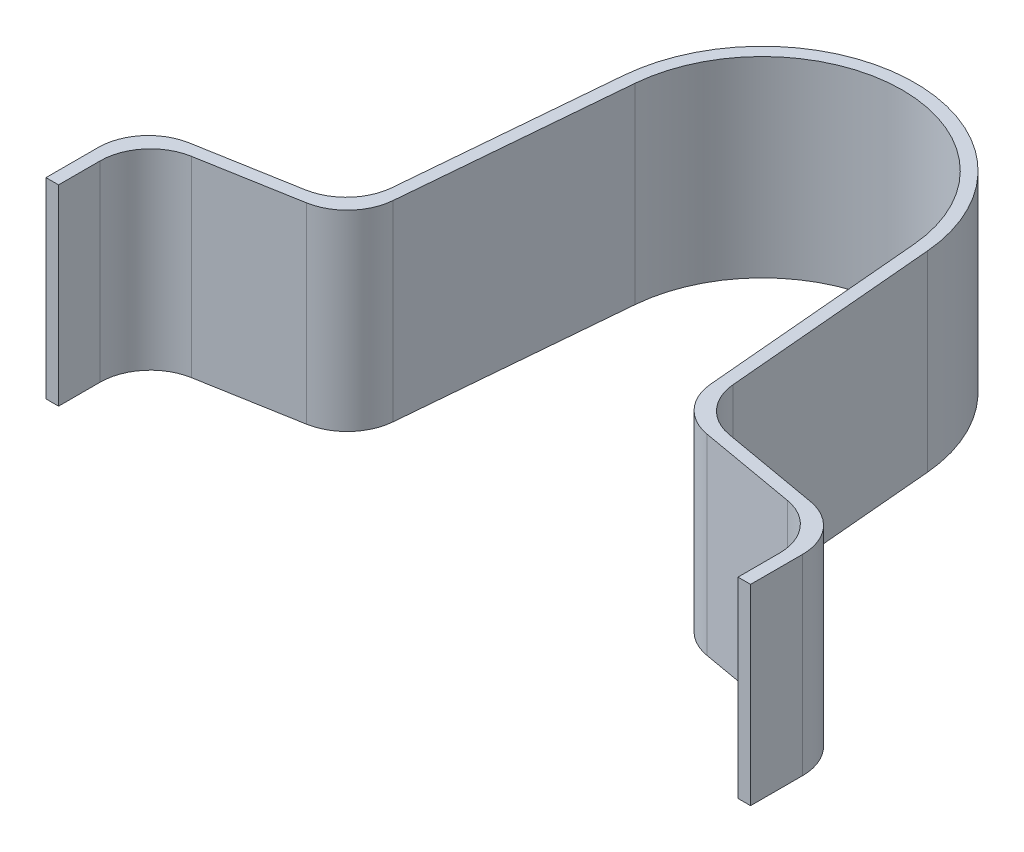
ISO-10303-21;
HEADER;
FILE_DESCRIPTION(('STEP AP214'),'2;1');
FILE_NAME('part.step','',(''),(''),'','','');
FILE_SCHEMA(('AUTOMOTIVE_DESIGN { 1 0 10303 214 1 1 1 1 }'));
ENDSEC;
DATA;
#1=APPLICATION_CONTEXT('core data for automotive mechanical design processes');
#2=APPLICATION_PROTOCOL_DEFINITION('international standard','automotive_design',2000,#1);
#3=PRODUCT_CONTEXT('',#1,'mechanical');
#4=PRODUCT('Part','Part','',(#3));
#5=PRODUCT_RELATED_PRODUCT_CATEGORY('part','',(#4));
#6=PRODUCT_DEFINITION_FORMATION('','',#4);
#7=PRODUCT_DEFINITION_CONTEXT('part definition',#1,'design');
#8=PRODUCT_DEFINITION('design','',#6,#7);
#9=PRODUCT_DEFINITION_SHAPE('','',#8);
#10=(LENGTH_UNIT() NAMED_UNIT(*) SI_UNIT(.MILLI.,.METRE.));
#11=(NAMED_UNIT(*) PLANE_ANGLE_UNIT() SI_UNIT($,.RADIAN.));
#12=(NAMED_UNIT(*) SI_UNIT($,.STERADIAN.) SOLID_ANGLE_UNIT());
#13=UNCERTAINTY_MEASURE_WITH_UNIT(LENGTH_MEASURE(1.E-05),#10,'distance_accuracy_value','');
#14=(GEOMETRIC_REPRESENTATION_CONTEXT(3) GLOBAL_UNCERTAINTY_ASSIGNED_CONTEXT((#13)) GLOBAL_UNIT_ASSIGNED_CONTEXT((#10,
#11,#12)) REPRESENTATION_CONTEXT('',''));
#15=CARTESIAN_POINT('',(0.,0.,0.));
#16=DIRECTION('',(0.,0.,1.));
#17=DIRECTION('',(1.,0.,0.));
#18=AXIS2_PLACEMENT_3D('',#15,#16,#17);
#19=CARTESIAN_POINT('',(0.,0.,0.));
#20=DIRECTION('',(0.,1.,0.));
#21=DIRECTION('',(0.,0.,1.));
#22=AXIS2_PLACEMENT_3D('',#19,#20,#21);
#23=PLANE('',#22);
#24=DIRECTION('',(0.984807753012209,0.,0.173648177666927));
#25=VECTOR('',#24,1.);
#26=CARTESIAN_POINT('',(27.6568491987389,0.,37.8889103884032));
#27=LINE('',#26,#25);
#28=CARTESIAN_POINT('',(33.7029273614535,0.,38.954997095962));
#29=VERTEX_POINT('',#28);
#30=CARTESIAN_POINT('',(49.4024437181634,0.,41.7232454137238));
#31=VERTEX_POINT('',#30);
#32=EDGE_CURVE('E432',#29,#31,#27,.T.);
#33=ORIENTED_EDGE('',*,*,#32,.T.);
#34=CARTESIAN_POINT('',(48.013258296828,0.,49.6017074378215));
#35=DIRECTION('',(0.,1.,0.));
#36=DIRECTION('',(0.,0.,1.));
#37=AXIS2_PLACEMENT_3D('',#34,#35,#36);
#38=CIRCLE('',#37,8.);
#39=CARTESIAN_POINT('',(56.013258296828,0.,49.6017074378215));
#40=VERTEX_POINT('',#39);
#41=EDGE_CURVE('E368',#31,#40,#38,.F.);
#42=ORIENTED_EDGE('',*,*,#41,.T.);
#43=DIRECTION('',(0.,0.,1.));
#44=VECTOR('',#43,1.);
#45=CARTESIAN_POINT('',(56.013258296828,0.,42.8889103884032));
#46=LINE('',#45,#44);
#47=CARTESIAN_POINT('',(56.013258296828,0.,57.8889103884032));
#48=VERTEX_POINT('',#47);
#49=EDGE_CURVE('E264',#40,#48,#46,.T.);
#50=ORIENTED_EDGE('',*,*,#49,.T.);
#51=DIRECTION('',(-1.,0.,0.));
#52=VECTOR('',#51,1.);
#53=CARTESIAN_POINT('',(56.013258296828,0.,57.8889103884032));
#54=LINE('',#53,#52);
#55=CARTESIAN_POINT('',(54.013258296828,0.,57.8889103884032));
#56=VERTEX_POINT('',#55);
#57=EDGE_CURVE('E266',#48,#56,#54,.T.);
#58=ORIENTED_EDGE('',*,*,#57,.T.);
#59=DIRECTION('',(0.,0.,-1.));
#60=VECTOR('',#59,1.);
#61=CARTESIAN_POINT('',(54.013258296828,0.,57.8889103884032));
#62=LINE('',#61,#60);
#63=CARTESIAN_POINT('',(54.013258296828,0.,51.279906700176));
#64=VERTEX_POINT('',#63);
#65=EDGE_CURVE('E246',#56,#64,#62,.T.);
#66=ORIENTED_EDGE('',*,*,#65,.T.);
#67=CARTESIAN_POINT('',(46.013258296828,0.,51.279906700176));
#68=DIRECTION('',(0.,1.,0.));
#69=DIRECTION('',(0.,0.,1.));
#70=AXIS2_PLACEMENT_3D('',#67,#68,#69);
#71=CIRCLE('',#70,8.);
#72=CARTESIAN_POINT('',(47.4024437181634,0.,43.4014446760784));
#73=VERTEX_POINT('',#72);
#74=EDGE_CURVE('E395',#64,#73,#71,.T.);
#75=ORIENTED_EDGE('',*,*,#74,.T.);
#76=DIRECTION('',(-0.984807753012209,0.,-0.173648177666927));
#77=VECTOR('',#76,1.);
#78=CARTESIAN_POINT('',(54.013258296828,0.,44.5671096507578));
#79=LINE('',#78,#77);
#80=CARTESIAN_POINT('',(31.844111465441,0.,40.6580909250968));
#81=VERTEX_POINT('',#80);
#82=EDGE_CURVE('E442',#73,#81,#79,.T.);
#83=ORIENTED_EDGE('',*,*,#82,.T.);
#84=CARTESIAN_POINT('',(33.2332968867764,0.,32.7796289009991));
#85=DIRECTION('',(0.,1.,0.));
#86=DIRECTION('',(0.,0.,1.));
#87=AXIS2_PLACEMENT_3D('',#84,#85,#86);
#88=CIRCLE('',#87,8.);
#89=CARTESIAN_POINT('',(25.2636589650312,0.,33.4759559766474));
#90=VERTEX_POINT('',#89);
#91=EDGE_CURVE('E81',#81,#90,#88,.F.);
#92=ORIENTED_EDGE('',*,*,#91,.T.);
#93=DIRECTION('',(0.0870408844560395,0.,0.996204740218149));
#94=VECTOR('',#93,1.);
#95=CARTESIAN_POINT('',(22.1695402888147,0.,-1.9370078426847));
#96=LINE('',#95,#94);
#97=CARTESIAN_POINT('',(22.1695402888147,0.,-1.93700784268471));
#98=VERTEX_POINT('',#97);
#99=EDGE_CURVE('E324',#98,#90,#96,.T.);
#100=ORIENTED_EDGE('',*,*,#99,.F.);
#101=CARTESIAN_POINT('',(0.,0.,0.));
#102=DIRECTION('',(0.,1.,0.));
#103=DIRECTION('',(0.,0.,1.));
#104=AXIS2_PLACEMENT_3D('',#101,#102,#103);
#105=CIRCLE('',#104,22.254);
#106=CARTESIAN_POINT('',(-22.1695402888147,0.,-1.93700784268471));
#107=VERTEX_POINT('',#106);
#108=EDGE_CURVE('E320',#98,#107,#105,.T.);
#109=ORIENTED_EDGE('',*,*,#108,.T.);
#110=DIRECTION('',(-0.0870408844560395,0.,0.996204740218149));
#111=VECTOR('',#110,1.);
#112=CARTESIAN_POINT('',(-22.1695402888147,0.,-1.9370078426847));
#113=LINE('',#112,#111);
#114=CARTESIAN_POINT('',(-25.2636589650312,0.,33.4759559766474));
#115=VERTEX_POINT('',#114);
#116=EDGE_CURVE('E317',#107,#115,#113,.T.);
#117=ORIENTED_EDGE('',*,*,#116,.T.);
#118=CARTESIAN_POINT('',(-33.2332968867764,0.,32.7796289009991));
#119=DIRECTION('',(0.,1.,0.));
#120=DIRECTION('',(0.,0.,1.));
#121=AXIS2_PLACEMENT_3D('',#118,#119,#120);
#122=CIRCLE('',#121,8.);
#123=CARTESIAN_POINT('',(-31.844111465441,0.,40.6580909250968));
#124=VERTEX_POINT('',#123);
#125=EDGE_CURVE('E363',#115,#124,#122,.F.);
#126=ORIENTED_EDGE('',*,*,#125,.T.);
#127=DIRECTION('',(-0.984807753012209,0.,0.173648177666927));
#128=VECTOR('',#127,1.);
#129=CARTESIAN_POINT('',(-54.0132582968279,0.,44.5671096507578));
#130=LINE('',#129,#128);
#131=CARTESIAN_POINT('',(-47.4024437181634,0.,43.4014446760784));
#132=VERTEX_POINT('',#131);
#133=EDGE_CURVE('E277',#124,#132,#130,.T.);
#134=ORIENTED_EDGE('',*,*,#133,.T.);
#135=CARTESIAN_POINT('',(-46.0132582968279,0.,51.279906700176));
#136=DIRECTION('',(0.,1.,0.));
#137=DIRECTION('',(0.,0.,1.));
#138=AXIS2_PLACEMENT_3D('',#135,#136,#137);
#139=CIRCLE('',#138,8.);
#140=CARTESIAN_POINT('',(-54.0132582968279,0.,51.279906700176));
#141=VERTEX_POINT('',#140);
#142=EDGE_CURVE('E399',#132,#141,#139,.T.);
#143=ORIENTED_EDGE('',*,*,#142,.T.);
#144=DIRECTION('',(0.,0.,1.));
#145=VECTOR('',#144,1.);
#146=CARTESIAN_POINT('',(-54.0132582968279,0.,57.8889103884032));
#147=LINE('',#146,#145);
#148=CARTESIAN_POINT('',(-54.0132582968279,0.,57.8889103884032));
#149=VERTEX_POINT('',#148);
#150=EDGE_CURVE('E275',#141,#149,#147,.T.);
#151=ORIENTED_EDGE('',*,*,#150,.T.);
#152=DIRECTION('',(-1.,0.,0.));
#153=VECTOR('',#152,1.);
#154=CARTESIAN_POINT('',(-56.0132582968279,0.,57.8889103884032));
#155=LINE('',#154,#153);
#156=CARTESIAN_POINT('',(-56.0132582968279,0.,57.8889103884032));
#157=VERTEX_POINT('',#156);
#158=EDGE_CURVE('E272',#149,#157,#155,.T.);
#159=ORIENTED_EDGE('',*,*,#158,.T.);
#160=DIRECTION('',(0.,0.,-1.));
#161=VECTOR('',#160,1.);
#162=CARTESIAN_POINT('',(-56.0132582968279,0.,42.8889103884032));
#163=LINE('',#162,#161);
#164=CARTESIAN_POINT('',(-56.0132582968279,0.,49.6017074378215));
#165=VERTEX_POINT('',#164);
#166=EDGE_CURVE('E269',#157,#165,#163,.T.);
#167=ORIENTED_EDGE('',*,*,#166,.T.);
#168=CARTESIAN_POINT('',(-48.0132582968279,0.,49.6017074378215));
#169=DIRECTION('',(0.,1.,0.));
#170=DIRECTION('',(0.,0.,1.));
#171=AXIS2_PLACEMENT_3D('',#168,#169,#170);
#172=CIRCLE('',#171,8.);
#173=CARTESIAN_POINT('',(-49.4024437181634,0.,41.7232454137238));
#174=VERTEX_POINT('',#173);
#175=EDGE_CURVE('E366',#165,#174,#172,.F.);
#176=ORIENTED_EDGE('',*,*,#175,.T.);
#177=DIRECTION('',(0.984807753012209,0.,-0.173648177666928));
#178=VECTOR('',#177,1.);
#179=CARTESIAN_POINT('',(-27.6568491987389,0.,37.8889103884032));
#180=LINE('',#179,#178);
#181=CARTESIAN_POINT('',(-33.7029273614535,0.,38.954997095962));
#182=VERTEX_POINT('',#181);
#183=EDGE_CURVE('E280',#174,#182,#180,.T.);
#184=ORIENTED_EDGE('',*,*,#183,.T.);
#185=CARTESIAN_POINT('',(-35.0921127827889,0.,31.0765350718644));
#186=DIRECTION('',(0.,1.,0.));
#187=DIRECTION('',(0.,0.,1.));
#188=AXIS2_PLACEMENT_3D('',#185,#186,#187);
#189=CIRCLE('',#188,8.);
#190=CARTESIAN_POINT('',(-27.1224748610437,0.,31.7728621475127));
#191=VERTEX_POINT('',#190);
#192=EDGE_CURVE('E12',#182,#191,#189,.T.);
#193=ORIENTED_EDGE('',*,*,#192,.T.);
#194=DIRECTION('',(-0.0870408844560396,0.,0.996204740218149));
#195=VECTOR('',#194,1.);
#196=CARTESIAN_POINT('',(-24.161949769251,0.,-2.11108961159679));
#197=LINE('',#196,#195);
#198=CARTESIAN_POINT('',(-24.161949769251,0.,-2.11108961159679));
#199=VERTEX_POINT('',#198);
#200=EDGE_CURVE('E305',#199,#191,#197,.T.);
#201=ORIENTED_EDGE('',*,*,#200,.F.);
#202=CARTESIAN_POINT('',(0.,0.,0.));
#203=DIRECTION('',(0.,1.,0.));
#204=DIRECTION('',(0.,0.,1.));
#205=AXIS2_PLACEMENT_3D('',#202,#203,#204);
#206=CIRCLE('',#205,24.254);
#207=CARTESIAN_POINT('',(24.161949769251,0.,-2.11108961159679));
#208=VERTEX_POINT('',#207);
#209=EDGE_CURVE('E326',#208,#199,#206,.T.);
#210=ORIENTED_EDGE('',*,*,#209,.F.);
#211=DIRECTION('',(0.0870408844560396,0.,0.996204740218149));
#212=VECTOR('',#211,1.);
#213=CARTESIAN_POINT('',(24.161949769251,0.,-2.11108961159679));
#214=LINE('',#213,#212);
#215=CARTESIAN_POINT('',(27.1224748610437,0.,31.7728621475127));
#216=VERTEX_POINT('',#215);
#217=EDGE_CURVE('E300',#208,#216,#214,.T.);
#218=ORIENTED_EDGE('',*,*,#217,.T.);
#219=CARTESIAN_POINT('',(35.0921127827889,0.,31.0765350718644));
#220=DIRECTION('',(0.,1.,0.));
#221=DIRECTION('',(0.,0.,1.));
#222=AXIS2_PLACEMENT_3D('',#219,#220,#221);
#223=CIRCLE('',#222,8.);
#224=EDGE_CURVE('E403',#216,#29,#223,.T.);
#225=ORIENTED_EDGE('',*,*,#224,.T.);
#226=EDGE_LOOP('',(#33,#42,#50,#58,#66,#75,#83,#92,#100,#109,#117,#126,#134,#143,#151,#159,#167,
#176,#184,#193,#201,#210,#218,#225));
#227=FACE_BOUND('',#226,.T.);
#228=ADVANCED_FACE('F66',(#227),#23,.F.);
#229=CARTESIAN_POINT('',(0.,30.48,0.));
#230=DIRECTION('',(0.,1.,0.));
#231=DIRECTION('',(0.,0.,1.));
#232=AXIS2_PLACEMENT_3D('',#229,#230,#231);
#233=PLANE('',#232);
#234=DIRECTION('',(0.,0.,-1.));
#235=VECTOR('',#234,1.);
#236=CARTESIAN_POINT('',(56.013258296828,30.48,42.8889103884032));
#237=LINE('',#236,#235);
#238=CARTESIAN_POINT('',(56.013258296828,30.48,57.8889103884032));
#239=VERTEX_POINT('',#238);
#240=CARTESIAN_POINT('',(56.013258296828,30.48,49.6017074378215));
#241=VERTEX_POINT('',#240);
#242=EDGE_CURVE('E255',#239,#241,#237,.T.);
#243=ORIENTED_EDGE('',*,*,#242,.T.);
#244=CARTESIAN_POINT('',(48.013258296828,30.48,49.6017074378215));
#245=DIRECTION('',(0.,1.,0.));
#246=DIRECTION('',(0.,0.,1.));
#247=AXIS2_PLACEMENT_3D('',#244,#245,#246);
#248=CIRCLE('',#247,8.);
#249=CARTESIAN_POINT('',(49.4024437181634,30.48,41.7232454137238));
#250=VERTEX_POINT('',#249);
#251=EDGE_CURVE('E356',#241,#250,#248,.T.);
#252=ORIENTED_EDGE('',*,*,#251,.T.);
#253=DIRECTION('',(-0.984807753012208,0.,-0.173648177666927));
#254=VECTOR('',#253,1.);
#255=CARTESIAN_POINT('',(27.6568491987389,30.48,37.8889103884032));
#256=LINE('',#255,#254);
#257=CARTESIAN_POINT('',(33.7029273614535,30.48,38.954997095962));
#258=VERTEX_POINT('',#257);
#259=EDGE_CURVE('E257',#250,#258,#256,.T.);
#260=ORIENTED_EDGE('',*,*,#259,.T.);
#261=CARTESIAN_POINT('',(35.0921127827889,30.48,31.0765350718644));
#262=DIRECTION('',(0.,1.,0.));
#263=DIRECTION('',(0.,0.,1.));
#264=AXIS2_PLACEMENT_3D('',#261,#262,#263);
#265=CIRCLE('',#264,8.);
#266=CARTESIAN_POINT('',(27.1224748610437,30.48,31.7728621475127));
#267=VERTEX_POINT('',#266);
#268=EDGE_CURVE('E401',#258,#267,#265,.F.);
#269=ORIENTED_EDGE('',*,*,#268,.T.);
#270=DIRECTION('',(0.0870408844560396,0.,0.996204740218149));
#271=VECTOR('',#270,1.);
#272=CARTESIAN_POINT('',(24.161949769251,30.48,-2.11108961159679));
#273=LINE('',#272,#271);
#274=CARTESIAN_POINT('',(24.161949769251,30.48,-2.11108961159679));
#275=VERTEX_POINT('',#274);
#276=EDGE_CURVE('E321',#275,#267,#273,.T.);
#277=ORIENTED_EDGE('',*,*,#276,.F.);
#278=CARTESIAN_POINT('',(0.,30.48,0.));
#279=DIRECTION('',(0.,1.,0.));
#280=DIRECTION('',(0.,0.,1.));
#281=AXIS2_PLACEMENT_3D('',#278,#279,#280);
#282=CIRCLE('',#281,24.254);
#283=CARTESIAN_POINT('',(-24.161949769251,30.48,-2.11108961159679));
#284=VERTEX_POINT('',#283);
#285=EDGE_CURVE('E311',#275,#284,#282,.T.);
#286=ORIENTED_EDGE('',*,*,#285,.T.);
#287=DIRECTION('',(-0.0870408844560396,0.,0.996204740218149));
#288=VECTOR('',#287,1.);
#289=CARTESIAN_POINT('',(-24.161949769251,30.48,-2.11108961159679));
#290=LINE('',#289,#288);
#291=CARTESIAN_POINT('',(-27.1224748610437,30.48,31.7728621475127));
#292=VERTEX_POINT('',#291);
#293=EDGE_CURVE('E313',#284,#292,#290,.T.);
#294=ORIENTED_EDGE('',*,*,#293,.T.);
#295=CARTESIAN_POINT('',(-35.0921127827889,30.48,31.0765350718644));
#296=DIRECTION('',(0.,1.,0.));
#297=DIRECTION('',(0.,0.,1.));
#298=AXIS2_PLACEMENT_3D('',#295,#296,#297);
#299=CIRCLE('',#298,8.);
#300=CARTESIAN_POINT('',(-33.7029273614535,30.48,38.954997095962));
#301=VERTEX_POINT('',#300);
#302=EDGE_CURVE('E74',#292,#301,#299,.F.);
#303=ORIENTED_EDGE('',*,*,#302,.T.);
#304=DIRECTION('',(-0.984807753012209,0.,0.173648177666928));
#305=VECTOR('',#304,1.);
#306=CARTESIAN_POINT('',(-27.6568491987389,30.48,37.8889103884032));
#307=LINE('',#306,#305);
#308=CARTESIAN_POINT('',(-49.4024437181634,30.48,41.7232454137238));
#309=VERTEX_POINT('',#308);
#310=EDGE_CURVE('E268',#301,#309,#307,.T.);
#311=ORIENTED_EDGE('',*,*,#310,.T.);
#312=CARTESIAN_POINT('',(-48.0132582968279,30.48,49.6017074378215));
#313=DIRECTION('',(0.,1.,0.));
#314=DIRECTION('',(0.,0.,1.));
#315=AXIS2_PLACEMENT_3D('',#312,#313,#314);
#316=CIRCLE('',#315,8.);
#317=CARTESIAN_POINT('',(-56.0132582968279,30.48,49.6017074378215));
#318=VERTEX_POINT('',#317);
#319=EDGE_CURVE('E354',#309,#318,#316,.T.);
#320=ORIENTED_EDGE('',*,*,#319,.T.);
#321=DIRECTION('',(0.,0.,1.));
#322=VECTOR('',#321,1.);
#323=CARTESIAN_POINT('',(-56.0132582968279,30.48,42.8889103884032));
#324=LINE('',#323,#322);
#325=CARTESIAN_POINT('',(-56.0132582968279,30.48,57.8889103884032));
#326=VERTEX_POINT('',#325);
#327=EDGE_CURVE('E283',#318,#326,#324,.T.);
#328=ORIENTED_EDGE('',*,*,#327,.T.);
#329=DIRECTION('',(1.,0.,0.));
#330=VECTOR('',#329,1.);
#331=CARTESIAN_POINT('',(-56.0132582968279,30.48,57.8889103884032));
#332=LINE('',#331,#330);
#333=CARTESIAN_POINT('',(-54.0132582968279,30.48,57.8889103884032));
#334=VERTEX_POINT('',#333);
#335=EDGE_CURVE('E285',#326,#334,#332,.T.);
#336=ORIENTED_EDGE('',*,*,#335,.T.);
#337=DIRECTION('',(0.,0.,-1.));
#338=VECTOR('',#337,1.);
#339=CARTESIAN_POINT('',(-54.0132582968279,30.48,57.8889103884032));
#340=LINE('',#339,#338);
#341=CARTESIAN_POINT('',(-54.0132582968279,30.48,51.279906700176));
#342=VERTEX_POINT('',#341);
#343=EDGE_CURVE('E288',#334,#342,#340,.T.);
#344=ORIENTED_EDGE('',*,*,#343,.T.);
#345=CARTESIAN_POINT('',(-46.0132582968279,30.48,51.279906700176));
#346=DIRECTION('',(0.,1.,0.));
#347=DIRECTION('',(0.,0.,1.));
#348=AXIS2_PLACEMENT_3D('',#345,#346,#347);
#349=CIRCLE('',#348,8.);
#350=CARTESIAN_POINT('',(-47.4024437181634,30.48,43.4014446760784));
#351=VERTEX_POINT('',#350);
#352=EDGE_CURVE('E397',#342,#351,#349,.F.);
#353=ORIENTED_EDGE('',*,*,#352,.T.);
#354=DIRECTION('',(0.984807753012209,0.,-0.173648177666927));
#355=VECTOR('',#354,1.);
#356=CARTESIAN_POINT('',(-54.0132582968279,30.48,44.5671096507578));
#357=LINE('',#356,#355);
#358=CARTESIAN_POINT('',(-31.844111465441,30.48,40.6580909250968));
#359=VERTEX_POINT('',#358);
#360=EDGE_CURVE('E291',#351,#359,#357,.T.);
#361=ORIENTED_EDGE('',*,*,#360,.T.);
#362=CARTESIAN_POINT('',(-33.2332968867764,30.48,32.7796289009991));
#363=DIRECTION('',(0.,1.,0.));
#364=DIRECTION('',(0.,0.,1.));
#365=AXIS2_PLACEMENT_3D('',#362,#363,#364);
#366=CIRCLE('',#365,8.);
#367=CARTESIAN_POINT('',(-25.2636589650312,30.48,33.4759559766474));
#368=VERTEX_POINT('',#367);
#369=EDGE_CURVE('E350',#359,#368,#366,.T.);
#370=ORIENTED_EDGE('',*,*,#369,.T.);
#371=DIRECTION('',(-0.0870408844560395,0.,0.996204740218149));
#372=VECTOR('',#371,1.);
#373=CARTESIAN_POINT('',(-22.1695402888147,30.48,-1.9370078426847));
#374=LINE('',#373,#372);
#375=CARTESIAN_POINT('',(-22.1695402888147,30.48,-1.93700784268471));
#376=VERTEX_POINT('',#375);
#377=EDGE_CURVE('E301',#376,#368,#374,.T.);
#378=ORIENTED_EDGE('',*,*,#377,.F.);
#379=CARTESIAN_POINT('',(0.,30.48,0.));
#380=DIRECTION('',(0.,1.,0.));
#381=DIRECTION('',(0.,0.,1.));
#382=AXIS2_PLACEMENT_3D('',#379,#380,#381);
#383=CIRCLE('',#382,22.254);
#384=CARTESIAN_POINT('',(22.1695402888147,30.48,-1.93700784268471));
#385=VERTEX_POINT('',#384);
#386=EDGE_CURVE('E304',#385,#376,#383,.T.);
#387=ORIENTED_EDGE('',*,*,#386,.F.);
#388=DIRECTION('',(0.0870408844560395,0.,0.996204740218149));
#389=VECTOR('',#388,1.);
#390=CARTESIAN_POINT('',(22.1695402888147,30.48,-1.9370078426847));
#391=LINE('',#390,#389);
#392=CARTESIAN_POINT('',(25.2636589650312,30.48,33.4759559766474));
#393=VERTEX_POINT('',#392);
#394=EDGE_CURVE('E308',#385,#393,#391,.T.);
#395=ORIENTED_EDGE('',*,*,#394,.T.);
#396=CARTESIAN_POINT('',(33.2332968867764,30.48,32.7796289009991));
#397=DIRECTION('',(0.,1.,0.));
#398=DIRECTION('',(0.,0.,1.));
#399=AXIS2_PLACEMENT_3D('',#396,#397,#398);
#400=CIRCLE('',#399,8.);
#401=CARTESIAN_POINT('',(31.844111465441,30.48,40.6580909250968));
#402=VERTEX_POINT('',#401);
#403=EDGE_CURVE('E352',#393,#402,#400,.T.);
#404=ORIENTED_EDGE('',*,*,#403,.T.);
#405=DIRECTION('',(0.984807753012209,0.,0.173648177666927));
#406=VECTOR('',#405,1.);
#407=CARTESIAN_POINT('',(54.013258296828,30.48,44.5671096507578));
#408=LINE('',#407,#406);
#409=CARTESIAN_POINT('',(47.4024437181634,30.48,43.4014446760784));
#410=VERTEX_POINT('',#409);
#411=EDGE_CURVE('E250',#402,#410,#408,.T.);
#412=ORIENTED_EDGE('',*,*,#411,.T.);
#413=CARTESIAN_POINT('',(46.013258296828,30.48,51.279906700176));
#414=DIRECTION('',(0.,1.,0.));
#415=DIRECTION('',(0.,0.,1.));
#416=AXIS2_PLACEMENT_3D('',#413,#414,#415);
#417=CIRCLE('',#416,8.);
#418=CARTESIAN_POINT('',(54.013258296828,30.48,51.279906700176));
#419=VERTEX_POINT('',#418);
#420=EDGE_CURVE('E237',#410,#419,#417,.F.);
#421=ORIENTED_EDGE('',*,*,#420,.T.);
#422=DIRECTION('',(0.,0.,1.));
#423=VECTOR('',#422,1.);
#424=CARTESIAN_POINT('',(54.013258296828,30.48,57.8889103884032));
#425=LINE('',#424,#423);
#426=CARTESIAN_POINT('',(54.013258296828,30.48,57.8889103884032));
#427=VERTEX_POINT('',#426);
#428=EDGE_CURVE('E230',#419,#427,#425,.T.);
#429=ORIENTED_EDGE('',*,*,#428,.T.);
#430=DIRECTION('',(1.,0.,0.));
#431=VECTOR('',#430,1.);
#432=CARTESIAN_POINT('',(56.013258296828,30.48,57.8889103884032));
#433=LINE('',#432,#431);
#434=EDGE_CURVE('E235',#427,#239,#433,.T.);
#435=ORIENTED_EDGE('',*,*,#434,.T.);
#436=EDGE_LOOP('',(#243,#252,#260,#269,#277,#286,#294,#303,#311,#320,#328,#336,#344,#353,#361,
#370,#378,#387,#395,#404,#412,#421,#429,#435));
#437=FACE_BOUND('',#436,.T.);
#438=ADVANCED_FACE('F233',(#437),#233,.T.);
#439=CARTESIAN_POINT('',(-22.1695402888147,30.48,-1.9370078426847));
#440=DIRECTION('',(0.996204740218149,0.,0.0870408844560396));
#441=DIRECTION('',(0.0870408844560396,0.,-0.996204740218149));
#442=AXIS2_PLACEMENT_3D('',#439,#440,#441);
#443=PLANE('',#442);
#444=ORIENTED_EDGE('',*,*,#377,.T.);
#445=DIRECTION('',(0.,-1.,0.));
#446=VECTOR('',#445,1.);
#447=CARTESIAN_POINT('',(-25.2636589650312,30.48,33.4759559766474));
#448=LINE('',#447,#446);
#449=EDGE_CURVE('E387',#368,#115,#448,.T.);
#450=ORIENTED_EDGE('',*,*,#449,.T.);
#451=ORIENTED_EDGE('',*,*,#116,.F.);
#452=DIRECTION('',(0.,-1.,0.));
#453=VECTOR('',#452,1.);
#454=CARTESIAN_POINT('',(-22.1695402888147,30.48,-1.93700784268471));
#455=LINE('',#454,#453);
#456=EDGE_CURVE('E334',#376,#107,#455,.T.);
#457=ORIENTED_EDGE('',*,*,#456,.F.);
#458=EDGE_LOOP('',(#444,#450,#451,#457));
#459=FACE_BOUND('',#458,.T.);
#460=ADVANCED_FACE('F467',(#459),#443,.T.);
#461=CARTESIAN_POINT('',(22.1695402888147,30.48,-1.9370078426847));
#462=DIRECTION('',(0.996204740218149,0.,-0.0870408844560396));
#463=DIRECTION('',(-0.0870408844560396,0.,-0.996204740218149));
#464=AXIS2_PLACEMENT_3D('',#461,#462,#463);
#465=PLANE('',#464);
#466=ORIENTED_EDGE('',*,*,#99,.T.);
#467=DIRECTION('',(0.,1.,0.));
#468=VECTOR('',#467,1.);
#469=CARTESIAN_POINT('',(25.2636589650312,30.48,33.4759559766474));
#470=LINE('',#469,#468);
#471=EDGE_CURVE('E384',#90,#393,#470,.T.);
#472=ORIENTED_EDGE('',*,*,#471,.T.);
#473=ORIENTED_EDGE('',*,*,#394,.F.);
#474=DIRECTION('',(0.,-1.,0.));
#475=VECTOR('',#474,1.);
#476=CARTESIAN_POINT('',(22.1695402888147,30.48,-1.93700784268471));
#477=LINE('',#476,#475);
#478=EDGE_CURVE('E332',#385,#98,#477,.T.);
#479=ORIENTED_EDGE('',*,*,#478,.T.);
#480=EDGE_LOOP('',(#466,#472,#473,#479));
#481=FACE_BOUND('',#480,.T.);
#482=ADVANCED_FACE('F460',(#481),#465,.F.);
#483=CARTESIAN_POINT('',(0.,30.48,0.));
#484=DIRECTION('',(0.,-1.,0.));
#485=DIRECTION('',(0.,0.,-1.));
#486=AXIS2_PLACEMENT_3D('',#483,#484,#485);
#487=CYLINDRICAL_SURFACE('',#486,24.254);
#488=ORIENTED_EDGE('',*,*,#285,.F.);
#489=DIRECTION('',(0.,-1.,0.));
#490=VECTOR('',#489,1.);
#491=CARTESIAN_POINT('',(24.161949769251,30.48,-2.11108961159679));
#492=LINE('',#491,#490);
#493=EDGE_CURVE('E336',#275,#208,#492,.T.);
#494=ORIENTED_EDGE('',*,*,#493,.T.);
#495=ORIENTED_EDGE('',*,*,#209,.T.);
#496=DIRECTION('',(0.,-1.,0.));
#497=VECTOR('',#496,1.);
#498=CARTESIAN_POINT('',(-24.161949769251,30.48,-2.11108961159679));
#499=LINE('',#498,#497);
#500=EDGE_CURVE('E316',#284,#199,#499,.T.);
#501=ORIENTED_EDGE('',*,*,#500,.F.);
#502=EDGE_LOOP('',(#488,#494,#495,#501));
#503=FACE_BOUND('',#502,.T.);
#504=ADVANCED_FACE('F422',(#503),#487,.T.);
#505=CARTESIAN_POINT('',(-24.161949769251,30.48,-2.11108961159679));
#506=DIRECTION('',(0.996204740218149,0.,0.0870408844560396));
#507=DIRECTION('',(0.0870408844560396,0.,-0.996204740218149));
#508=AXIS2_PLACEMENT_3D('',#505,#506,#507);
#509=PLANE('',#508);
#510=ORIENTED_EDGE('',*,*,#200,.T.);
#511=DIRECTION('',(0.,1.,0.));
#512=VECTOR('',#511,1.);
#513=CARTESIAN_POINT('',(-27.1224748610437,30.48,31.7728621475127));
#514=LINE('',#513,#512);
#515=EDGE_CURVE('E391',#191,#292,#514,.T.);
#516=ORIENTED_EDGE('',*,*,#515,.T.);
#517=ORIENTED_EDGE('',*,*,#293,.F.);
#518=ORIENTED_EDGE('',*,*,#500,.T.);
#519=EDGE_LOOP('',(#510,#516,#517,#518));
#520=FACE_BOUND('',#519,.T.);
#521=ADVANCED_FACE('F418',(#520),#509,.F.);
#522=CARTESIAN_POINT('',(0.,30.48,0.));
#523=DIRECTION('',(0.,-1.,0.));
#524=DIRECTION('',(0.,0.,-1.));
#525=AXIS2_PLACEMENT_3D('',#522,#523,#524);
#526=CYLINDRICAL_SURFACE('',#525,22.254);
#527=ORIENTED_EDGE('',*,*,#108,.F.);
#528=ORIENTED_EDGE('',*,*,#478,.F.);
#529=ORIENTED_EDGE('',*,*,#386,.T.);
#530=ORIENTED_EDGE('',*,*,#456,.T.);
#531=EDGE_LOOP('',(#527,#528,#529,#530));
#532=FACE_BOUND('',#531,.T.);
#533=ADVANCED_FACE('F463',(#532),#526,.F.);
#534=CARTESIAN_POINT('',(24.161949769251,30.48,-2.11108961159679));
#535=DIRECTION('',(0.996204740218149,0.,-0.0870408844560396));
#536=DIRECTION('',(-0.0870408844560396,0.,-0.996204740218149));
#537=AXIS2_PLACEMENT_3D('',#534,#535,#536);
#538=PLANE('',#537);
#539=ORIENTED_EDGE('',*,*,#276,.T.);
#540=DIRECTION('',(0.,1.,0.));
#541=VECTOR('',#540,1.);
#542=CARTESIAN_POINT('',(27.1224748610437,0.,31.7728621475127));
#543=LINE('',#542,#541);
#544=EDGE_CURVE('E89',#267,#216,#543,.F.);
#545=ORIENTED_EDGE('',*,*,#544,.T.);
#546=ORIENTED_EDGE('',*,*,#217,.F.);
#547=ORIENTED_EDGE('',*,*,#493,.F.);
#548=EDGE_LOOP('',(#539,#545,#546,#547));
#549=FACE_BOUND('',#548,.T.);
#550=ADVANCED_FACE('F524',(#549),#538,.T.);
#551=CARTESIAN_POINT('',(-54.0132582968279,-34.6999414543913,44.5671096507578));
#552=DIRECTION('',(0.173648177666927,0.,0.984807753012208));
#553=DIRECTION('',(0.984807753012209,0.,-0.173648177666927));
#554=AXIS2_PLACEMENT_3D('',#551,#552,#553);
#555=PLANE('',#554);
#556=ORIENTED_EDGE('',*,*,#360,.F.);
#557=DIRECTION('',(0.,1.,0.));
#558=VECTOR('',#557,1.);
#559=CARTESIAN_POINT('',(-47.4024437181634,0.,43.4014446760784));
#560=LINE('',#559,#558);
#561=EDGE_CURVE('E382',#351,#132,#560,.F.);
#562=ORIENTED_EDGE('',*,*,#561,.T.);
#563=ORIENTED_EDGE('',*,*,#133,.F.);
#564=DIRECTION('',(0.,-1.,0.));
#565=VECTOR('',#564,1.);
#566=CARTESIAN_POINT('',(-31.844111465441,-34.6999414543913,40.6580909250968));
#567=LINE('',#566,#565);
#568=EDGE_CURVE('E380',#124,#359,#567,.F.);
#569=ORIENTED_EDGE('',*,*,#568,.T.);
#570=EDGE_LOOP('',(#556,#562,#563,#569));
#571=FACE_BOUND('',#570,.T.);
#572=ADVANCED_FACE('F475',(#571),#555,.T.);
#573=CARTESIAN_POINT('',(-54.0132582968279,-34.6999414543913,57.8889103884032));
#574=DIRECTION('',(1.,0.,0.));
#575=DIRECTION('',(0.,0.,-1.));
#576=AXIS2_PLACEMENT_3D('',#573,#574,#575);
#577=PLANE('',#576);
#578=ORIENTED_EDGE('',*,*,#150,.F.);
#579=DIRECTION('',(0.,1.,0.));
#580=VECTOR('',#579,1.);
#581=CARTESIAN_POINT('',(-54.0132582968279,30.48,51.279906700176));
#582=LINE('',#581,#580);
#583=EDGE_CURVE('E377',#141,#342,#582,.T.);
#584=ORIENTED_EDGE('',*,*,#583,.T.);
#585=ORIENTED_EDGE('',*,*,#343,.F.);
#586=DIRECTION('',(0.,1.,0.));
#587=VECTOR('',#586,1.);
#588=CARTESIAN_POINT('',(-54.0132582968279,-34.6999414543913,57.8889103884032));
#589=LINE('',#588,#587);
#590=EDGE_CURVE('E273',#149,#334,#589,.T.);
#591=ORIENTED_EDGE('',*,*,#590,.F.);
#592=EDGE_LOOP('',(#578,#584,#585,#591));
#593=FACE_BOUND('',#592,.T.);
#594=ADVANCED_FACE('F486',(#593),#577,.T.);
#595=CARTESIAN_POINT('',(-56.0132582968279,-34.6999414543913,57.8889103884032));
#596=DIRECTION('',(0.,0.,1.));
#597=DIRECTION('',(1.,0.,0.));
#598=AXIS2_PLACEMENT_3D('',#595,#596,#597);
#599=PLANE('',#598);
#600=ORIENTED_EDGE('',*,*,#158,.F.);
#601=ORIENTED_EDGE('',*,*,#590,.T.);
#602=ORIENTED_EDGE('',*,*,#335,.F.);
#603=DIRECTION('',(0.,1.,0.));
#604=VECTOR('',#603,1.);
#605=CARTESIAN_POINT('',(-56.0132582968279,-34.6999414543913,57.8889103884032));
#606=LINE('',#605,#604);
#607=EDGE_CURVE('E294',#157,#326,#606,.T.);
#608=ORIENTED_EDGE('',*,*,#607,.F.);
#609=EDGE_LOOP('',(#600,#601,#602,#608));
#610=FACE_BOUND('',#609,.T.);
#611=ADVANCED_FACE('F490',(#610),#599,.T.);
#612=CARTESIAN_POINT('',(-56.0132582968279,-34.6999414543913,42.8889103884032));
#613=DIRECTION('',(-1.,0.,0.));
#614=DIRECTION('',(0.,0.,1.));
#615=AXIS2_PLACEMENT_3D('',#612,#613,#614);
#616=PLANE('',#615);
#617=ORIENTED_EDGE('',*,*,#327,.F.);
#618=DIRECTION('',(0.,1.,0.));
#619=VECTOR('',#618,1.);
#620=CARTESIAN_POINT('',(-56.0132582968279,-34.6999414543913,49.6017074378215));
#621=LINE('',#620,#619);
#622=EDGE_CURVE('E375',#318,#165,#621,.F.);
#623=ORIENTED_EDGE('',*,*,#622,.T.);
#624=ORIENTED_EDGE('',*,*,#166,.F.);
#625=ORIENTED_EDGE('',*,*,#607,.T.);
#626=EDGE_LOOP('',(#617,#623,#624,#625));
#627=FACE_BOUND('',#626,.T.);
#628=ADVANCED_FACE('F496',(#627),#616,.T.);
#629=CARTESIAN_POINT('',(-27.6568491987389,-34.6999414543913,37.8889103884032));
#630=DIRECTION('',(-0.173648177666928,0.,-0.984807753012208));
#631=DIRECTION('',(-0.984807753012209,0.,0.173648177666928));
#632=AXIS2_PLACEMENT_3D('',#629,#630,#631);
#633=PLANE('',#632);
#634=ORIENTED_EDGE('',*,*,#183,.F.);
#635=DIRECTION('',(0.,1.,0.));
#636=VECTOR('',#635,1.);
#637=CARTESIAN_POINT('',(-49.4024437181634,-34.6999414543913,41.7232454137238));
#638=LINE('',#637,#636);
#639=EDGE_CURVE('E372',#174,#309,#638,.T.);
#640=ORIENTED_EDGE('',*,*,#639,.T.);
#641=ORIENTED_EDGE('',*,*,#310,.F.);
#642=DIRECTION('',(0.,1.,0.));
#643=VECTOR('',#642,1.);
#644=CARTESIAN_POINT('',(-33.7029273614535,-34.6999414543913,38.954997095962));
#645=LINE('',#644,#643);
#646=EDGE_CURVE('E370',#301,#182,#645,.F.);
#647=ORIENTED_EDGE('',*,*,#646,.T.);
#648=EDGE_LOOP('',(#634,#640,#641,#647));
#649=FACE_BOUND('',#648,.T.);
#650=ADVANCED_FACE('F411',(#649),#633,.T.);
#651=CARTESIAN_POINT('',(54.013258296828,-34.6999414543913,57.8889103884032));
#652=DIRECTION('',(-1.,0.,0.));
#653=DIRECTION('',(0.,0.,1.));
#654=AXIS2_PLACEMENT_3D('',#651,#652,#653);
#655=PLANE('',#654);
#656=ORIENTED_EDGE('',*,*,#428,.F.);
#657=DIRECTION('',(0.,1.,0.));
#658=VECTOR('',#657,1.);
#659=CARTESIAN_POINT('',(54.013258296828,0.,51.279906700176));
#660=LINE('',#659,#658);
#661=EDGE_CURVE('E345',#419,#64,#660,.F.);
#662=ORIENTED_EDGE('',*,*,#661,.T.);
#663=ORIENTED_EDGE('',*,*,#65,.F.);
#664=DIRECTION('',(0.,1.,0.));
#665=VECTOR('',#664,1.);
#666=CARTESIAN_POINT('',(54.013258296828,-34.6999414543913,57.8889103884032));
#667=LINE('',#666,#665);
#668=EDGE_CURVE('E243',#56,#427,#667,.T.);
#669=ORIENTED_EDGE('',*,*,#668,.T.);
#670=EDGE_LOOP('',(#656,#662,#663,#669));
#671=FACE_BOUND('',#670,.T.);
#672=ADVANCED_FACE('F244',(#671),#655,.T.);
#673=CARTESIAN_POINT('',(54.013258296828,-34.6999414543913,44.5671096507578));
#674=DIRECTION('',(-0.173648177666927,0.,0.984807753012209));
#675=DIRECTION('',(0.984807753012209,0.,0.173648177666927));
#676=AXIS2_PLACEMENT_3D('',#673,#674,#675);
#677=PLANE('',#676);
#678=ORIENTED_EDGE('',*,*,#82,.F.);
#679=DIRECTION('',(0.,1.,0.));
#680=VECTOR('',#679,1.);
#681=CARTESIAN_POINT('',(47.4024437181634,30.48,43.4014446760784));
#682=LINE('',#681,#680);
#683=EDGE_CURVE('E342',#73,#410,#682,.T.);
#684=ORIENTED_EDGE('',*,*,#683,.T.);
#685=ORIENTED_EDGE('',*,*,#411,.F.);
#686=DIRECTION('',(0.,1.,0.));
#687=VECTOR('',#686,1.);
#688=CARTESIAN_POINT('',(31.844111465441,0.,40.6580909250967));
#689=LINE('',#688,#687);
#690=EDGE_CURVE('E338',#402,#81,#689,.F.);
#691=ORIENTED_EDGE('',*,*,#690,.T.);
#692=EDGE_LOOP('',(#678,#684,#685,#691));
#693=FACE_BOUND('',#692,.T.);
#694=ADVANCED_FACE('F452',(#693),#677,.T.);
#695=CARTESIAN_POINT('',(27.6568491987389,-34.6999414543913,37.8889103884032));
#696=DIRECTION('',(0.173648177666927,0.,-0.984807753012208));
#697=DIRECTION('',(-0.984807753012209,0.,-0.173648177666927));
#698=AXIS2_PLACEMENT_3D('',#695,#696,#697);
#699=PLANE('',#698);
#700=ORIENTED_EDGE('',*,*,#259,.F.);
#701=DIRECTION('',(0.,1.,0.));
#702=VECTOR('',#701,1.);
#703=CARTESIAN_POINT('',(49.4024437181634,-34.6999414543913,41.7232454137238));
#704=LINE('',#703,#702);
#705=EDGE_CURVE('E361',#250,#31,#704,.F.);
#706=ORIENTED_EDGE('',*,*,#705,.T.);
#707=ORIENTED_EDGE('',*,*,#32,.F.);
#708=DIRECTION('',(0.,1.,0.));
#709=VECTOR('',#708,1.);
#710=CARTESIAN_POINT('',(33.7029273614535,30.48,38.954997095962));
#711=LINE('',#710,#709);
#712=EDGE_CURVE('E358',#29,#258,#711,.T.);
#713=ORIENTED_EDGE('',*,*,#712,.T.);
#714=EDGE_LOOP('',(#700,#706,#707,#713));
#715=FACE_BOUND('',#714,.T.);
#716=ADVANCED_FACE('F430',(#715),#699,.T.);
#717=CARTESIAN_POINT('',(56.013258296828,-34.6999414543913,42.8889103884032));
#718=DIRECTION('',(1.,0.,0.));
#719=DIRECTION('',(0.,0.,-1.));
#720=AXIS2_PLACEMENT_3D('',#717,#718,#719);
#721=PLANE('',#720);
#722=ORIENTED_EDGE('',*,*,#49,.F.);
#723=DIRECTION('',(0.,1.,0.));
#724=VECTOR('',#723,1.);
#725=CARTESIAN_POINT('',(56.013258296828,-34.6999414543913,49.6017074378215));
#726=LINE('',#725,#724);
#727=EDGE_CURVE('E347',#40,#241,#726,.T.);
#728=ORIENTED_EDGE('',*,*,#727,.T.);
#729=ORIENTED_EDGE('',*,*,#242,.F.);
#730=DIRECTION('',(0.,1.,0.));
#731=VECTOR('',#730,1.);
#732=CARTESIAN_POINT('',(56.013258296828,-34.6999414543913,57.8889103884032));
#733=LINE('',#732,#731);
#734=EDGE_CURVE('E249',#48,#239,#733,.T.);
#735=ORIENTED_EDGE('',*,*,#734,.F.);
#736=EDGE_LOOP('',(#722,#728,#729,#735));
#737=FACE_BOUND('',#736,.T.);
#738=ADVANCED_FACE('F440',(#737),#721,.T.);
#739=CARTESIAN_POINT('',(56.013258296828,-34.6999414543913,57.8889103884032));
#740=DIRECTION('',(0.,0.,1.));
#741=DIRECTION('',(1.,0.,0.));
#742=AXIS2_PLACEMENT_3D('',#739,#740,#741);
#743=PLANE('',#742);
#744=ORIENTED_EDGE('',*,*,#57,.F.);
#745=ORIENTED_EDGE('',*,*,#734,.T.);
#746=ORIENTED_EDGE('',*,*,#434,.F.);
#747=ORIENTED_EDGE('',*,*,#668,.F.);
#748=EDGE_LOOP('',(#744,#745,#746,#747));
#749=FACE_BOUND('',#748,.T.);
#750=ADVANCED_FACE('F252',(#749),#743,.T.);
#751=CARTESIAN_POINT('',(46.013258296828,-34.6999414543913,51.279906700176));
#752=DIRECTION('',(0.,-1.,0.));
#753=DIRECTION('',(0.,0.,-1.));
#754=AXIS2_PLACEMENT_3D('',#751,#752,#753);
#755=CYLINDRICAL_SURFACE('',#754,8.);
#756=ORIENTED_EDGE('',*,*,#74,.F.);
#757=ORIENTED_EDGE('',*,*,#661,.F.);
#758=ORIENTED_EDGE('',*,*,#420,.F.);
#759=ORIENTED_EDGE('',*,*,#683,.F.);
#760=EDGE_LOOP('',(#756,#757,#758,#759));
#761=FACE_BOUND('',#760,.T.);
#762=ADVANCED_FACE('F449',(#761),#755,.F.);
#763=CARTESIAN_POINT('',(48.013258296828,-34.6999414543913,49.6017074378215));
#764=DIRECTION('',(0.,1.,0.));
#765=DIRECTION('',(0.,0.,1.));
#766=AXIS2_PLACEMENT_3D('',#763,#764,#765);
#767=CYLINDRICAL_SURFACE('',#766,8.);
#768=ORIENTED_EDGE('',*,*,#41,.F.);
#769=ORIENTED_EDGE('',*,*,#705,.F.);
#770=ORIENTED_EDGE('',*,*,#251,.F.);
#771=ORIENTED_EDGE('',*,*,#727,.F.);
#772=EDGE_LOOP('',(#768,#769,#770,#771));
#773=FACE_BOUND('',#772,.T.);
#774=ADVANCED_FACE('F437',(#773),#767,.T.);
#775=CARTESIAN_POINT('',(-48.0132582968279,-34.6999414543913,49.6017074378215));
#776=DIRECTION('',(0.,1.,0.));
#777=DIRECTION('',(0.,0.,1.));
#778=AXIS2_PLACEMENT_3D('',#775,#776,#777);
#779=CYLINDRICAL_SURFACE('',#778,8.);
#780=ORIENTED_EDGE('',*,*,#175,.F.);
#781=ORIENTED_EDGE('',*,*,#622,.F.);
#782=ORIENTED_EDGE('',*,*,#319,.F.);
#783=ORIENTED_EDGE('',*,*,#639,.F.);
#784=EDGE_LOOP('',(#780,#781,#782,#783));
#785=FACE_BOUND('',#784,.T.);
#786=ADVANCED_FACE('F499',(#785),#779,.T.);
#787=CARTESIAN_POINT('',(-46.0132582968279,-34.6999414543913,51.279906700176));
#788=DIRECTION('',(0.,-1.,0.));
#789=DIRECTION('',(0.,0.,-1.));
#790=AXIS2_PLACEMENT_3D('',#787,#788,#789);
#791=CYLINDRICAL_SURFACE('',#790,8.);
#792=ORIENTED_EDGE('',*,*,#142,.F.);
#793=ORIENTED_EDGE('',*,*,#561,.F.);
#794=ORIENTED_EDGE('',*,*,#352,.F.);
#795=ORIENTED_EDGE('',*,*,#583,.F.);
#796=EDGE_LOOP('',(#792,#793,#794,#795));
#797=FACE_BOUND('',#796,.T.);
#798=ADVANCED_FACE('F480',(#797),#791,.F.);
#799=CARTESIAN_POINT('',(33.2332968867764,30.48,32.7796289009991));
#800=DIRECTION('',(0.,-1.,0.));
#801=DIRECTION('',(0.,0.,-1.));
#802=AXIS2_PLACEMENT_3D('',#799,#800,#801);
#803=CYLINDRICAL_SURFACE('',#802,8.);
#804=ORIENTED_EDGE('',*,*,#91,.F.);
#805=ORIENTED_EDGE('',*,*,#690,.F.);
#806=ORIENTED_EDGE('',*,*,#403,.F.);
#807=ORIENTED_EDGE('',*,*,#471,.F.);
#808=EDGE_LOOP('',(#804,#805,#806,#807));
#809=FACE_BOUND('',#808,.T.);
#810=ADVANCED_FACE('F458',(#809),#803,.T.);
#811=CARTESIAN_POINT('',(-33.2332968867764,30.48,32.7796289009991));
#812=DIRECTION('',(0.,-1.,0.));
#813=DIRECTION('',(0.,0.,-1.));
#814=AXIS2_PLACEMENT_3D('',#811,#812,#813);
#815=CYLINDRICAL_SURFACE('',#814,8.);
#816=ORIENTED_EDGE('',*,*,#369,.F.);
#817=ORIENTED_EDGE('',*,*,#568,.F.);
#818=ORIENTED_EDGE('',*,*,#125,.F.);
#819=ORIENTED_EDGE('',*,*,#449,.F.);
#820=EDGE_LOOP('',(#816,#817,#818,#819));
#821=FACE_BOUND('',#820,.T.);
#822=ADVANCED_FACE('F478',(#821),#815,.T.);
#823=CARTESIAN_POINT('',(35.0921127827889,-34.6999414543913,31.0765350718644));
#824=DIRECTION('',(0.,-1.,0.));
#825=DIRECTION('',(0.,0.,-1.));
#826=AXIS2_PLACEMENT_3D('',#823,#824,#825);
#827=CYLINDRICAL_SURFACE('',#826,8.);
#828=ORIENTED_EDGE('',*,*,#224,.F.);
#829=ORIENTED_EDGE('',*,*,#544,.F.);
#830=ORIENTED_EDGE('',*,*,#268,.F.);
#831=ORIENTED_EDGE('',*,*,#712,.F.);
#832=EDGE_LOOP('',(#828,#829,#830,#831));
#833=FACE_BOUND('',#832,.T.);
#834=ADVANCED_FACE('F427',(#833),#827,.F.);
#835=CARTESIAN_POINT('',(-35.0921127827889,30.48,31.0765350718644));
#836=DIRECTION('',(0.,1.,0.));
#837=DIRECTION('',(0.,0.,1.));
#838=AXIS2_PLACEMENT_3D('',#835,#836,#837);
#839=CYLINDRICAL_SURFACE('',#838,8.);
#840=ORIENTED_EDGE('',*,*,#192,.F.);
#841=ORIENTED_EDGE('',*,*,#646,.F.);
#842=ORIENTED_EDGE('',*,*,#302,.F.);
#843=ORIENTED_EDGE('',*,*,#515,.F.);
#844=EDGE_LOOP('',(#840,#841,#842,#843));
#845=FACE_BOUND('',#844,.T.);
#846=ADVANCED_FACE('F68',(#845),#839,.F.);
#847=CLOSED_SHELL('',(#228,#438,#460,#482,#504,#521,#533,#550,#572,#594,#611,#628,#650,#672,
#694,#716,#738,#750,#762,#774,#786,#798,#810,#822,#834,#846));
#848=MANIFOLD_SOLID_BREP('B2',#847);
#849=ADVANCED_BREP_SHAPE_REPRESENTATION('',(#18,#848),#14);
#850=SHAPE_DEFINITION_REPRESENTATION(#9,#849);
ENDSEC;
END-ISO-10303-21;
